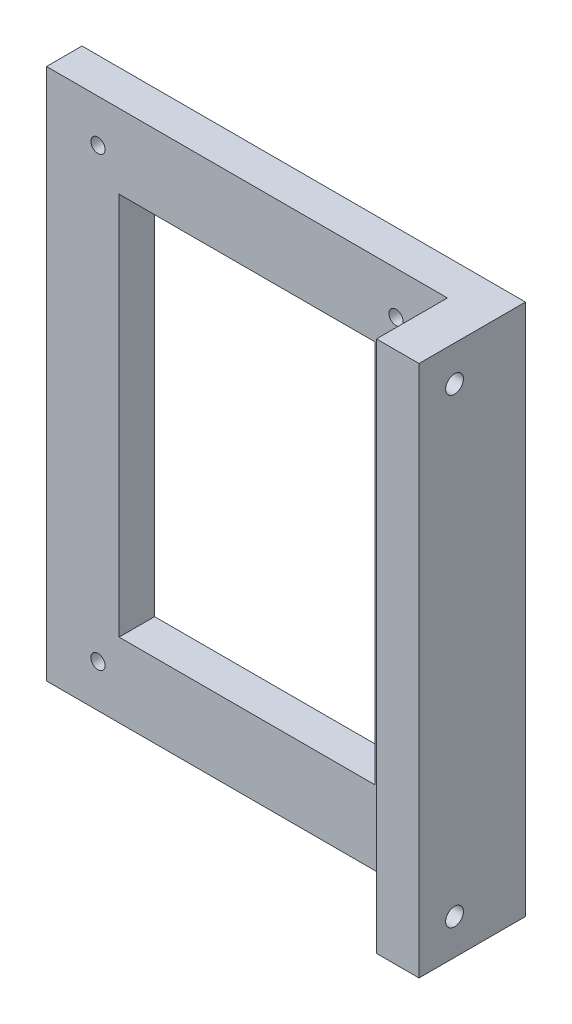
ISO-10303-21;
HEADER;
FILE_DESCRIPTION(('STEP AP214'),'2;1');
FILE_NAME('part.step','',(''),(''),'','','');
FILE_SCHEMA(('AUTOMOTIVE_DESIGN { 1 0 10303 214 1 1 1 1 }'));
ENDSEC;
DATA;
#1=APPLICATION_CONTEXT('core data for automotive mechanical design processes');
#2=APPLICATION_PROTOCOL_DEFINITION('international standard','automotive_design',2000,#1);
#3=PRODUCT_CONTEXT('',#1,'mechanical');
#4=PRODUCT('Part','Part','',(#3));
#5=PRODUCT_RELATED_PRODUCT_CATEGORY('part','',(#4));
#6=PRODUCT_DEFINITION_FORMATION('','',#4);
#7=PRODUCT_DEFINITION_CONTEXT('part definition',#1,'design');
#8=PRODUCT_DEFINITION('design','',#6,#7);
#9=PRODUCT_DEFINITION_SHAPE('','',#8);
#10=(LENGTH_UNIT() NAMED_UNIT(*) SI_UNIT(.MILLI.,.METRE.));
#11=(NAMED_UNIT(*) PLANE_ANGLE_UNIT() SI_UNIT($,.RADIAN.));
#12=(NAMED_UNIT(*) SI_UNIT($,.STERADIAN.) SOLID_ANGLE_UNIT());
#13=UNCERTAINTY_MEASURE_WITH_UNIT(LENGTH_MEASURE(1.E-05),#10,'distance_accuracy_value','');
#14=(GEOMETRIC_REPRESENTATION_CONTEXT(3) GLOBAL_UNCERTAINTY_ASSIGNED_CONTEXT((#13)) GLOBAL_UNIT_ASSIGNED_CONTEXT((#10,
#11,#12)) REPRESENTATION_CONTEXT('',''));
#15=CARTESIAN_POINT('',(0.,0.,0.));
#16=DIRECTION('',(0.,0.,1.));
#17=DIRECTION('',(1.,0.,0.));
#18=AXIS2_PLACEMENT_3D('',#15,#16,#17);
#19=CARTESIAN_POINT('',(105.384615384615,38.1923076923077,20.));
#20=DIRECTION('',(-1.,0.,0.));
#21=DIRECTION('',(0.,-1.,0.));
#22=AXIS2_PLACEMENT_3D('',#19,#20,#21);
#23=CYLINDRICAL_SURFACE('',#22,2.5);
#24=CARTESIAN_POINT('',(105.384615384615,38.1923076923077,20.));
#25=DIRECTION('',(-1.,0.,0.));
#26=DIRECTION('',(0.,-1.,0.));
#27=AXIS2_PLACEMENT_3D('',#24,#25,#26);
#28=CIRCLE('',#27,2.5);
#29=CARTESIAN_POINT('',(105.384615384615,35.6923076923077,20.));
#30=VERTEX_POINT('',#29);
#31=EDGE_CURVE('E155',#30,#30,#28,.T.);
#32=ORIENTED_EDGE('',*,*,#31,.F.);
#33=EDGE_LOOP('',(#32));
#34=FACE_BOUND('',#33,.T.);
#35=CARTESIAN_POINT('',(98.3846153846154,38.1923076923077,20.));
#36=DIRECTION('',(-1.,0.,0.));
#37=DIRECTION('',(0.,-1.,0.));
#38=AXIS2_PLACEMENT_3D('',#35,#36,#37);
#39=CIRCLE('',#38,2.5);
#40=CARTESIAN_POINT('',(98.3846153846154,35.6923076923077,20.));
#41=VERTEX_POINT('',#40);
#42=EDGE_CURVE('E221',#41,#41,#39,.F.);
#43=ORIENTED_EDGE('',*,*,#42,.F.);
#44=EDGE_LOOP('',(#43));
#45=FACE_BOUND('',#44,.T.);
#46=ADVANCED_FACE('F33',(#34,#45),#23,.F.);
#47=CARTESIAN_POINT('',(0.,0.,10.));
#48=DIRECTION('',(0.,0.,1.));
#49=DIRECTION('',(1.,0.,0.));
#50=AXIS2_PLACEMENT_3D('',#47,#48,#49);
#51=PLANE('',#50);
#52=CARTESIAN_POINT('',(78.8846153846154,-89.8076923076923,10.));
#53=DIRECTION('',(0.,0.,1.));
#54=DIRECTION('',(1.,0.,0.));
#55=AXIS2_PLACEMENT_3D('',#52,#53,#54);
#56=CIRCLE('',#55,2.);
#57=CARTESIAN_POINT('',(80.8846153846154,-89.8076923076923,10.));
#58=VERTEX_POINT('',#57);
#59=EDGE_CURVE('E192',#58,#58,#56,.T.);
#60=ORIENTED_EDGE('',*,*,#59,.F.);
#61=EDGE_LOOP('',(#60));
#62=FACE_BOUND('',#61,.T.);
#63=CARTESIAN_POINT('',(78.8846153846154,36.1923076923077,10.));
#64=DIRECTION('',(0.,0.,1.));
#65=DIRECTION('',(1.,0.,0.));
#66=AXIS2_PLACEMENT_3D('',#63,#64,#65);
#67=CIRCLE('',#66,2.);
#68=CARTESIAN_POINT('',(80.8846153846154,36.1923076923077,10.));
#69=VERTEX_POINT('',#68);
#70=EDGE_CURVE('E204',#69,#69,#67,.T.);
#71=ORIENTED_EDGE('',*,*,#70,.F.);
#72=EDGE_LOOP('',(#71));
#73=FACE_BOUND('',#72,.T.);
#74=DIRECTION('',(0.,-1.,0.));
#75=VECTOR('',#74,1.);
#76=CARTESIAN_POINT('',(-19.6153846153846,48.1923076923077,10.));
#77=LINE('',#76,#75);
#78=CARTESIAN_POINT('',(-19.6153846153846,48.1923076923077,10.));
#79=VERTEX_POINT('',#78);
#80=CARTESIAN_POINT('',(-19.6153846153846,-101.807692307692,10.));
#81=VERTEX_POINT('',#80);
#82=EDGE_CURVE('E125',#79,#81,#77,.T.);
#83=ORIENTED_EDGE('',*,*,#82,.T.);
#84=DIRECTION('',(1.,0.,0.));
#85=VECTOR('',#84,1.);
#86=CARTESIAN_POINT('',(-19.6153846153846,-101.807692307692,10.));
#87=LINE('',#86,#85);
#88=CARTESIAN_POINT('',(93.3846153846154,-101.807692307692,10.));
#89=VERTEX_POINT('',#88);
#90=EDGE_CURVE('E211',#81,#89,#87,.T.);
#91=ORIENTED_EDGE('',*,*,#90,.T.);
#92=DIRECTION('',(0.,1.,0.));
#93=VECTOR('',#92,1.);
#94=CARTESIAN_POINT('',(93.3846153846154,48.1923076923077,10.));
#95=LINE('',#94,#93);
#96=CARTESIAN_POINT('',(93.3846153846154,48.1923076923077,10.));
#97=VERTEX_POINT('',#96);
#98=EDGE_CURVE('E214',#89,#97,#95,.T.);
#99=ORIENTED_EDGE('',*,*,#98,.T.);
#100=DIRECTION('',(-1.,0.,0.));
#101=VECTOR('',#100,1.);
#102=CARTESIAN_POINT('',(-19.6153846153846,48.1923076923077,10.));
#103=LINE('',#102,#101);
#104=EDGE_CURVE('E217',#97,#79,#103,.T.);
#105=ORIENTED_EDGE('',*,*,#104,.T.);
#106=EDGE_LOOP('',(#83,#91,#99,#105));
#107=FACE_BOUND('',#106,.T.);
#108=CARTESIAN_POINT('',(-5.11538461538462,36.1923076923077,10.));
#109=DIRECTION('',(0.,0.,1.));
#110=DIRECTION('',(1.,0.,0.));
#111=AXIS2_PLACEMENT_3D('',#108,#109,#110);
#112=CIRCLE('',#111,2.);
#113=CARTESIAN_POINT('',(-3.11538461538462,36.1923076923077,10.));
#114=VERTEX_POINT('',#113);
#115=EDGE_CURVE('E198',#114,#114,#112,.T.);
#116=ORIENTED_EDGE('',*,*,#115,.F.);
#117=EDGE_LOOP('',(#116));
#118=FACE_BOUND('',#117,.T.);
#119=CARTESIAN_POINT('',(-5.11538461538462,-89.8076923076923,10.));
#120=DIRECTION('',(0.,0.,1.));
#121=DIRECTION('',(1.,0.,0.));
#122=AXIS2_PLACEMENT_3D('',#119,#120,#121);
#123=CIRCLE('',#122,2.);
#124=CARTESIAN_POINT('',(-3.11538461538462,-89.8076923076923,10.));
#125=VERTEX_POINT('',#124);
#126=EDGE_CURVE('E186',#125,#125,#123,.T.);
#127=ORIENTED_EDGE('',*,*,#126,.F.);
#128=EDGE_LOOP('',(#127));
#129=FACE_BOUND('',#128,.T.);
#130=DIRECTION('',(-1.,0.,0.));
#131=VECTOR('',#130,1.);
#132=CARTESIAN_POINT('',(0.84258804237855,27.2553487056629,10.));
#133=LINE('',#132,#131);
#134=CARTESIAN_POINT('',(72.9266427268523,27.2553487056629,10.));
#135=VERTEX_POINT('',#134);
#136=CARTESIAN_POINT('',(0.84258804237855,27.2553487056629,10.));
#137=VERTEX_POINT('',#136);
#138=EDGE_CURVE('E162',#135,#137,#133,.T.);
#139=ORIENTED_EDGE('',*,*,#138,.F.);
#140=DIRECTION('',(0.,1.,0.));
#141=VECTOR('',#140,1.);
#142=CARTESIAN_POINT('',(72.9266427268523,27.2553487056629,10.));
#143=LINE('',#142,#141);
#144=CARTESIAN_POINT('',(72.9266427268523,-80.8707333210476,10.));
#145=VERTEX_POINT('',#144);
#146=EDGE_CURVE('E160',#145,#135,#143,.T.);
#147=ORIENTED_EDGE('',*,*,#146,.F.);
#148=DIRECTION('',(1.,0.,0.));
#149=VECTOR('',#148,1.);
#150=CARTESIAN_POINT('',(0.84258804237855,-80.8707333210476,10.));
#151=LINE('',#150,#149);
#152=CARTESIAN_POINT('',(0.84258804237855,-80.8707333210476,10.));
#153=VERTEX_POINT('',#152);
#154=EDGE_CURVE('E167',#153,#145,#151,.T.);
#155=ORIENTED_EDGE('',*,*,#154,.F.);
#156=DIRECTION('',(0.,-1.,0.));
#157=VECTOR('',#156,1.);
#158=CARTESIAN_POINT('',(0.84258804237855,27.2553487056629,10.));
#159=LINE('',#158,#157);
#160=EDGE_CURVE('E165',#137,#153,#159,.T.);
#161=ORIENTED_EDGE('',*,*,#160,.F.);
#162=EDGE_LOOP('',(#139,#147,#155,#161));
#163=FACE_BOUND('',#162,.T.);
#164=ADVANCED_FACE('F262',(#62,#73,#107,#118,#129,#163),#51,.T.);
#165=CARTESIAN_POINT('',(0.,0.,0.));
#166=DIRECTION('',(0.,0.,1.));
#167=DIRECTION('',(1.,0.,0.));
#168=AXIS2_PLACEMENT_3D('',#165,#166,#167);
#169=PLANE('',#168);
#170=CARTESIAN_POINT('',(-5.11538461538462,-89.8076923076923,0.));
#171=DIRECTION('',(0.,0.,1.));
#172=DIRECTION('',(1.,0.,0.));
#173=AXIS2_PLACEMENT_3D('',#170,#171,#172);
#174=CIRCLE('',#173,2.);
#175=CARTESIAN_POINT('',(-3.11538461538462,-89.8076923076923,0.));
#176=VERTEX_POINT('',#175);
#177=EDGE_CURVE('E185',#176,#176,#174,.T.);
#178=ORIENTED_EDGE('',*,*,#177,.T.);
#179=EDGE_LOOP('',(#178));
#180=FACE_BOUND('',#179,.T.);
#181=CARTESIAN_POINT('',(78.8846153846154,-89.8076923076923,0.));
#182=DIRECTION('',(0.,0.,1.));
#183=DIRECTION('',(1.,0.,0.));
#184=AXIS2_PLACEMENT_3D('',#181,#182,#183);
#185=CIRCLE('',#184,2.);
#186=CARTESIAN_POINT('',(80.8846153846154,-89.8076923076923,0.));
#187=VERTEX_POINT('',#186);
#188=EDGE_CURVE('E189',#187,#187,#185,.T.);
#189=ORIENTED_EDGE('',*,*,#188,.T.);
#190=EDGE_LOOP('',(#189));
#191=FACE_BOUND('',#190,.T.);
#192=CARTESIAN_POINT('',(-5.11538461538462,36.1923076923077,0.));
#193=DIRECTION('',(0.,0.,1.));
#194=DIRECTION('',(1.,0.,0.));
#195=AXIS2_PLACEMENT_3D('',#192,#193,#194);
#196=CIRCLE('',#195,2.);
#197=CARTESIAN_POINT('',(-3.11538461538462,36.1923076923077,0.));
#198=VERTEX_POINT('',#197);
#199=EDGE_CURVE('E195',#198,#198,#196,.T.);
#200=ORIENTED_EDGE('',*,*,#199,.T.);
#201=EDGE_LOOP('',(#200));
#202=FACE_BOUND('',#201,.T.);
#203=CARTESIAN_POINT('',(78.8846153846154,36.1923076923077,0.));
#204=DIRECTION('',(0.,0.,1.));
#205=DIRECTION('',(1.,0.,0.));
#206=AXIS2_PLACEMENT_3D('',#203,#204,#205);
#207=CIRCLE('',#206,2.);
#208=CARTESIAN_POINT('',(80.8846153846154,36.1923076923077,0.));
#209=VERTEX_POINT('',#208);
#210=EDGE_CURVE('E201',#209,#209,#207,.T.);
#211=ORIENTED_EDGE('',*,*,#210,.T.);
#212=EDGE_LOOP('',(#211));
#213=FACE_BOUND('',#212,.T.);
#214=DIRECTION('',(0.,-1.,0.));
#215=VECTOR('',#214,1.);
#216=CARTESIAN_POINT('',(-19.6153846153846,48.1923076923077,0.));
#217=LINE('',#216,#215);
#218=CARTESIAN_POINT('',(-19.6153846153846,48.1923076923077,0.));
#219=VERTEX_POINT('',#218);
#220=CARTESIAN_POINT('',(-19.6153846153846,-101.807692307692,0.));
#221=VERTEX_POINT('',#220);
#222=EDGE_CURVE('E121',#219,#221,#217,.T.);
#223=ORIENTED_EDGE('',*,*,#222,.F.);
#224=DIRECTION('',(-1.,0.,0.));
#225=VECTOR('',#224,1.);
#226=CARTESIAN_POINT('',(-19.6153846153846,48.1923076923077,0.));
#227=LINE('',#226,#225);
#228=CARTESIAN_POINT('',(105.384615384615,48.1923076923077,0.));
#229=VERTEX_POINT('',#228);
#230=EDGE_CURVE('E114',#229,#219,#227,.T.);
#231=ORIENTED_EDGE('',*,*,#230,.F.);
#232=DIRECTION('',(0.,1.,0.));
#233=VECTOR('',#232,1.);
#234=CARTESIAN_POINT('',(105.384615384615,48.1923076923077,0.));
#235=LINE('',#234,#233);
#236=CARTESIAN_POINT('',(105.384615384615,-101.807692307692,0.));
#237=VERTEX_POINT('',#236);
#238=EDGE_CURVE('E119',#237,#229,#235,.T.);
#239=ORIENTED_EDGE('',*,*,#238,.F.);
#240=DIRECTION('',(1.,0.,0.));
#241=VECTOR('',#240,1.);
#242=CARTESIAN_POINT('',(-19.6153846153846,-101.807692307692,0.));
#243=LINE('',#242,#241);
#244=EDGE_CURVE('E126',#221,#237,#243,.T.);
#245=ORIENTED_EDGE('',*,*,#244,.F.);
#246=EDGE_LOOP('',(#223,#231,#239,#245));
#247=FACE_BOUND('',#246,.T.);
#248=DIRECTION('',(0.,1.,0.));
#249=VECTOR('',#248,1.);
#250=CARTESIAN_POINT('',(72.9266427268523,27.2553487056629,0.));
#251=LINE('',#250,#249);
#252=CARTESIAN_POINT('',(72.9266427268523,-80.8707333210476,0.));
#253=VERTEX_POINT('',#252);
#254=CARTESIAN_POINT('',(72.9266427268523,27.2553487056629,0.));
#255=VERTEX_POINT('',#254);
#256=EDGE_CURVE('E58',#253,#255,#251,.T.);
#257=ORIENTED_EDGE('',*,*,#256,.T.);
#258=DIRECTION('',(-1.,0.,0.));
#259=VECTOR('',#258,1.);
#260=CARTESIAN_POINT('',(0.84258804237855,27.2553487056629,0.));
#261=LINE('',#260,#259);
#262=CARTESIAN_POINT('',(0.84258804237855,27.2553487056629,0.));
#263=VERTEX_POINT('',#262);
#264=EDGE_CURVE('E171',#255,#263,#261,.T.);
#265=ORIENTED_EDGE('',*,*,#264,.T.);
#266=DIRECTION('',(0.,-1.,0.));
#267=VECTOR('',#266,1.);
#268=CARTESIAN_POINT('',(0.84258804237855,27.2553487056629,0.));
#269=LINE('',#268,#267);
#270=CARTESIAN_POINT('',(0.84258804237855,-80.8707333210476,0.));
#271=VERTEX_POINT('',#270);
#272=EDGE_CURVE('E174',#263,#271,#269,.T.);
#273=ORIENTED_EDGE('',*,*,#272,.T.);
#274=DIRECTION('',(1.,0.,0.));
#275=VECTOR('',#274,1.);
#276=CARTESIAN_POINT('',(0.84258804237855,-80.8707333210476,0.));
#277=LINE('',#276,#275);
#278=EDGE_CURVE('E163',#271,#253,#277,.T.);
#279=ORIENTED_EDGE('',*,*,#278,.T.);
#280=EDGE_LOOP('',(#257,#265,#273,#279));
#281=FACE_BOUND('',#280,.T.);
#282=ADVANCED_FACE('F116',(#180,#191,#202,#213,#247,#281),#169,.F.);
#283=CARTESIAN_POINT('',(-19.6153846153846,48.1923076923077,10.));
#284=DIRECTION('',(1.,0.,0.));
#285=DIRECTION('',(0.,1.,0.));
#286=AXIS2_PLACEMENT_3D('',#283,#284,#285);
#287=PLANE('',#286);
#288=ORIENTED_EDGE('',*,*,#222,.T.);
#289=DIRECTION('',(0.,0.,-1.));
#290=VECTOR('',#289,1.);
#291=CARTESIAN_POINT('',(-19.6153846153846,-101.807692307692,10.));
#292=LINE('',#291,#290);
#293=EDGE_CURVE('E11',#81,#221,#292,.T.);
#294=ORIENTED_EDGE('',*,*,#293,.F.);
#295=ORIENTED_EDGE('',*,*,#82,.F.);
#296=DIRECTION('',(0.,0.,-1.));
#297=VECTOR('',#296,1.);
#298=CARTESIAN_POINT('',(-19.6153846153846,48.1923076923077,10.));
#299=LINE('',#298,#297);
#300=EDGE_CURVE('E42',#79,#219,#299,.T.);
#301=ORIENTED_EDGE('',*,*,#300,.T.);
#302=EDGE_LOOP('',(#288,#294,#295,#301));
#303=FACE_BOUND('',#302,.T.);
#304=ADVANCED_FACE('F35',(#303),#287,.F.);
#305=CARTESIAN_POINT('',(-19.6153846153846,-101.807692307692,10.));
#306=DIRECTION('',(0.,1.,0.));
#307=DIRECTION('',(-1.,0.,0.));
#308=AXIS2_PLACEMENT_3D('',#305,#306,#307);
#309=PLANE('',#308);
#310=ORIENTED_EDGE('',*,*,#244,.T.);
#311=DIRECTION('',(0.,0.,-1.));
#312=VECTOR('',#311,1.);
#313=CARTESIAN_POINT('',(105.384615384615,-101.807692307692,0.));
#314=LINE('',#313,#312);
#315=CARTESIAN_POINT('',(105.384615384615,-101.807692307692,30.));
#316=VERTEX_POINT('',#315);
#317=EDGE_CURVE('E140',#316,#237,#314,.T.);
#318=ORIENTED_EDGE('',*,*,#317,.F.);
#319=DIRECTION('',(-1.,0.,0.));
#320=VECTOR('',#319,1.);
#321=CARTESIAN_POINT('',(105.384615384615,-101.807692307692,30.));
#322=LINE('',#321,#320);
#323=CARTESIAN_POINT('',(93.3846153846154,-101.807692307692,30.));
#324=VERTEX_POINT('',#323);
#325=EDGE_CURVE('E152',#316,#324,#322,.T.);
#326=ORIENTED_EDGE('',*,*,#325,.T.);
#327=DIRECTION('',(0.,0.,-1.));
#328=VECTOR('',#327,1.);
#329=CARTESIAN_POINT('',(93.3846153846154,-101.807692307692,0.));
#330=LINE('',#329,#328);
#331=EDGE_CURVE('E141',#324,#89,#330,.T.);
#332=ORIENTED_EDGE('',*,*,#331,.T.);
#333=ORIENTED_EDGE('',*,*,#90,.F.);
#334=ORIENTED_EDGE('',*,*,#293,.T.);
#335=EDGE_LOOP('',(#310,#318,#326,#332,#333,#334));
#336=FACE_BOUND('',#335,.T.);
#337=ADVANCED_FACE('F298',(#336),#309,.F.);
#338=CARTESIAN_POINT('',(-19.6153846153846,48.1923076923077,10.));
#339=DIRECTION('',(0.,-1.,0.));
#340=DIRECTION('',(1.,0.,0.));
#341=AXIS2_PLACEMENT_3D('',#338,#339,#340);
#342=PLANE('',#341);
#343=ORIENTED_EDGE('',*,*,#230,.T.);
#344=ORIENTED_EDGE('',*,*,#300,.F.);
#345=ORIENTED_EDGE('',*,*,#104,.F.);
#346=DIRECTION('',(0.,0.,1.));
#347=VECTOR('',#346,1.);
#348=CARTESIAN_POINT('',(93.3846153846154,48.1923076923077,0.));
#349=LINE('',#348,#347);
#350=CARTESIAN_POINT('',(93.3846153846154,48.1923076923077,30.));
#351=VERTEX_POINT('',#350);
#352=EDGE_CURVE('E153',#97,#351,#349,.T.);
#353=ORIENTED_EDGE('',*,*,#352,.T.);
#354=DIRECTION('',(-1.,0.,0.));
#355=VECTOR('',#354,1.);
#356=CARTESIAN_POINT('',(105.384615384615,48.1923076923077,30.));
#357=LINE('',#356,#355);
#358=CARTESIAN_POINT('',(105.384615384615,48.1923076923077,30.));
#359=VERTEX_POINT('',#358);
#360=EDGE_CURVE('E132',#359,#351,#357,.T.);
#361=ORIENTED_EDGE('',*,*,#360,.F.);
#362=DIRECTION('',(0.,0.,1.));
#363=VECTOR('',#362,1.);
#364=CARTESIAN_POINT('',(105.384615384615,48.1923076923077,0.));
#365=LINE('',#364,#363);
#366=EDGE_CURVE('E129',#229,#359,#365,.T.);
#367=ORIENTED_EDGE('',*,*,#366,.F.);
#368=EDGE_LOOP('',(#343,#344,#345,#353,#361,#367));
#369=FACE_BOUND('',#368,.T.);
#370=ADVANCED_FACE('F130',(#369),#342,.F.);
#371=CARTESIAN_POINT('',(78.8846153846154,36.1923076923077,10.));
#372=DIRECTION('',(0.,0.,-1.));
#373=DIRECTION('',(-1.,0.,0.));
#374=AXIS2_PLACEMENT_3D('',#371,#372,#373);
#375=CYLINDRICAL_SURFACE('',#374,2.);
#376=ORIENTED_EDGE('',*,*,#70,.T.);
#377=EDGE_LOOP('',(#376));
#378=FACE_BOUND('',#377,.T.);
#379=ORIENTED_EDGE('',*,*,#210,.F.);
#380=EDGE_LOOP('',(#379));
#381=FACE_BOUND('',#380,.T.);
#382=ADVANCED_FACE('F334',(#378,#381),#375,.F.);
#383=CARTESIAN_POINT('',(-5.11538461538462,36.1923076923077,10.));
#384=DIRECTION('',(0.,0.,-1.));
#385=DIRECTION('',(-1.,0.,0.));
#386=AXIS2_PLACEMENT_3D('',#383,#384,#385);
#387=CYLINDRICAL_SURFACE('',#386,2.);
#388=ORIENTED_EDGE('',*,*,#115,.T.);
#389=EDGE_LOOP('',(#388));
#390=FACE_BOUND('',#389,.T.);
#391=ORIENTED_EDGE('',*,*,#199,.F.);
#392=EDGE_LOOP('',(#391));
#393=FACE_BOUND('',#392,.T.);
#394=ADVANCED_FACE('F330',(#390,#393),#387,.F.);
#395=CARTESIAN_POINT('',(78.8846153846154,-89.8076923076923,10.));
#396=DIRECTION('',(0.,0.,-1.));
#397=DIRECTION('',(-1.,0.,0.));
#398=AXIS2_PLACEMENT_3D('',#395,#396,#397);
#399=CYLINDRICAL_SURFACE('',#398,2.);
#400=ORIENTED_EDGE('',*,*,#59,.T.);
#401=EDGE_LOOP('',(#400));
#402=FACE_BOUND('',#401,.T.);
#403=ORIENTED_EDGE('',*,*,#188,.F.);
#404=EDGE_LOOP('',(#403));
#405=FACE_BOUND('',#404,.T.);
#406=ADVANCED_FACE('F326',(#402,#405),#399,.F.);
#407=CARTESIAN_POINT('',(-5.11538461538462,-89.8076923076923,10.));
#408=DIRECTION('',(0.,0.,-1.));
#409=DIRECTION('',(-1.,0.,0.));
#410=AXIS2_PLACEMENT_3D('',#407,#408,#409);
#411=CYLINDRICAL_SURFACE('',#410,2.);
#412=ORIENTED_EDGE('',*,*,#126,.T.);
#413=EDGE_LOOP('',(#412));
#414=FACE_BOUND('',#413,.T.);
#415=ORIENTED_EDGE('',*,*,#177,.F.);
#416=EDGE_LOOP('',(#415));
#417=FACE_BOUND('',#416,.T.);
#418=ADVANCED_FACE('F323',(#414,#417),#411,.F.);
#419=CARTESIAN_POINT('',(72.9266427268523,27.2553487056629,10.));
#420=DIRECTION('',(-1.,0.,0.));
#421=DIRECTION('',(0.,0.,1.));
#422=AXIS2_PLACEMENT_3D('',#419,#420,#421);
#423=PLANE('',#422);
#424=ORIENTED_EDGE('',*,*,#256,.F.);
#425=DIRECTION('',(0.,0.,-1.));
#426=VECTOR('',#425,1.);
#427=CARTESIAN_POINT('',(72.9266427268523,-80.8707333210476,10.));
#428=LINE('',#427,#426);
#429=EDGE_CURVE('E169',#145,#253,#428,.T.);
#430=ORIENTED_EDGE('',*,*,#429,.F.);
#431=ORIENTED_EDGE('',*,*,#146,.T.);
#432=DIRECTION('',(0.,0.,-1.));
#433=VECTOR('',#432,1.);
#434=CARTESIAN_POINT('',(72.9266427268523,27.2553487056629,10.));
#435=LINE('',#434,#433);
#436=EDGE_CURVE('E183',#135,#255,#435,.T.);
#437=ORIENTED_EDGE('',*,*,#436,.T.);
#438=EDGE_LOOP('',(#424,#430,#431,#437));
#439=FACE_BOUND('',#438,.T.);
#440=ADVANCED_FACE('F319',(#439),#423,.T.);
#441=CARTESIAN_POINT('',(0.84258804237855,27.2553487056629,10.));
#442=DIRECTION('',(0.,-1.,0.));
#443=DIRECTION('',(0.,0.,-1.));
#444=AXIS2_PLACEMENT_3D('',#441,#442,#443);
#445=PLANE('',#444);
#446=ORIENTED_EDGE('',*,*,#264,.F.);
#447=ORIENTED_EDGE('',*,*,#436,.F.);
#448=ORIENTED_EDGE('',*,*,#138,.T.);
#449=DIRECTION('',(0.,0.,-1.));
#450=VECTOR('',#449,1.);
#451=CARTESIAN_POINT('',(0.84258804237855,27.2553487056629,10.));
#452=LINE('',#451,#450);
#453=EDGE_CURVE('E181',#137,#263,#452,.T.);
#454=ORIENTED_EDGE('',*,*,#453,.T.);
#455=EDGE_LOOP('',(#446,#447,#448,#454));
#456=FACE_BOUND('',#455,.T.);
#457=ADVANCED_FACE('F315',(#456),#445,.T.);
#458=CARTESIAN_POINT('',(0.84258804237855,27.2553487056629,10.));
#459=DIRECTION('',(1.,0.,0.));
#460=DIRECTION('',(0.,0.,-1.));
#461=AXIS2_PLACEMENT_3D('',#458,#459,#460);
#462=PLANE('',#461);
#463=ORIENTED_EDGE('',*,*,#272,.F.);
#464=ORIENTED_EDGE('',*,*,#453,.F.);
#465=ORIENTED_EDGE('',*,*,#160,.T.);
#466=DIRECTION('',(0.,0.,-1.));
#467=VECTOR('',#466,1.);
#468=CARTESIAN_POINT('',(0.84258804237855,-80.8707333210476,10.));
#469=LINE('',#468,#467);
#470=EDGE_CURVE('E50',#153,#271,#469,.T.);
#471=ORIENTED_EDGE('',*,*,#470,.T.);
#472=EDGE_LOOP('',(#463,#464,#465,#471));
#473=FACE_BOUND('',#472,.T.);
#474=ADVANCED_FACE('F312',(#473),#462,.T.);
#475=CARTESIAN_POINT('',(0.84258804237855,-80.8707333210476,10.));
#476=DIRECTION('',(0.,1.,0.));
#477=DIRECTION('',(0.,0.,1.));
#478=AXIS2_PLACEMENT_3D('',#475,#476,#477);
#479=PLANE('',#478);
#480=ORIENTED_EDGE('',*,*,#278,.F.);
#481=ORIENTED_EDGE('',*,*,#470,.F.);
#482=ORIENTED_EDGE('',*,*,#154,.T.);
#483=ORIENTED_EDGE('',*,*,#429,.T.);
#484=EDGE_LOOP('',(#480,#481,#482,#483));
#485=FACE_BOUND('',#484,.T.);
#486=ADVANCED_FACE('F289',(#485),#479,.T.);
#487=CARTESIAN_POINT('',(93.3846153846154,0.,0.));
#488=DIRECTION('',(-1.,0.,0.));
#489=DIRECTION('',(0.,-1.,0.));
#490=AXIS2_PLACEMENT_3D('',#487,#488,#489);
#491=PLANE('',#490);
#492=CARTESIAN_POINT('',(93.3846153846154,38.1923076923077,20.));
#493=DIRECTION('',(-1.,0.,0.));
#494=DIRECTION('',(0.,-1.,0.));
#495=AXIS2_PLACEMENT_3D('',#492,#493,#494);
#496=CIRCLE('',#495,4.5);
#497=CARTESIAN_POINT('',(93.3846153846154,33.6923076923077,20.));
#498=VERTEX_POINT('',#497);
#499=EDGE_CURVE('E228',#498,#498,#496,.T.);
#500=ORIENTED_EDGE('',*,*,#499,.F.);
#501=EDGE_LOOP('',(#500));
#502=FACE_BOUND('',#501,.T.);
#503=CARTESIAN_POINT('',(93.3846153846154,-91.8076923076923,19.9999999999999));
#504=DIRECTION('',(-1.,0.,0.));
#505=DIRECTION('',(0.,1.,0.));
#506=AXIS2_PLACEMENT_3D('',#503,#504,#505);
#507=CIRCLE('',#506,4.5);
#508=CARTESIAN_POINT('',(93.3846153846154,-87.3076923076923,19.9999999999999));
#509=VERTEX_POINT('',#508);
#510=EDGE_CURVE('E238',#509,#509,#507,.T.);
#511=ORIENTED_EDGE('',*,*,#510,.F.);
#512=EDGE_LOOP('',(#511));
#513=FACE_BOUND('',#512,.T.);
#514=ORIENTED_EDGE('',*,*,#98,.F.);
#515=ORIENTED_EDGE('',*,*,#331,.F.);
#516=DIRECTION('',(0.,-1.,0.));
#517=VECTOR('',#516,1.);
#518=CARTESIAN_POINT('',(93.3846153846154,48.1923076923077,30.));
#519=LINE('',#518,#517);
#520=EDGE_CURVE('E144',#351,#324,#519,.T.);
#521=ORIENTED_EDGE('',*,*,#520,.F.);
#522=ORIENTED_EDGE('',*,*,#352,.F.);
#523=EDGE_LOOP('',(#514,#515,#521,#522));
#524=FACE_BOUND('',#523,.T.);
#525=ADVANCED_FACE('F286',(#502,#513,#524),#491,.T.);
#526=CARTESIAN_POINT('',(105.384615384615,48.1923076923077,30.));
#527=DIRECTION('',(0.,0.,-1.));
#528=DIRECTION('',(0.,1.,0.));
#529=AXIS2_PLACEMENT_3D('',#526,#527,#528);
#530=PLANE('',#529);
#531=ORIENTED_EDGE('',*,*,#520,.T.);
#532=ORIENTED_EDGE('',*,*,#325,.F.);
#533=DIRECTION('',(0.,-1.,0.));
#534=VECTOR('',#533,1.);
#535=CARTESIAN_POINT('',(105.384615384615,48.1923076923077,30.));
#536=LINE('',#535,#534);
#537=EDGE_CURVE('E135',#359,#316,#536,.T.);
#538=ORIENTED_EDGE('',*,*,#537,.F.);
#539=ORIENTED_EDGE('',*,*,#360,.T.);
#540=EDGE_LOOP('',(#531,#532,#538,#539));
#541=FACE_BOUND('',#540,.T.);
#542=ADVANCED_FACE('F258',(#541),#530,.F.);
#543=CARTESIAN_POINT('',(105.384615384615,0.,0.));
#544=DIRECTION('',(-1.,0.,0.));
#545=DIRECTION('',(0.,-1.,0.));
#546=AXIS2_PLACEMENT_3D('',#543,#544,#545);
#547=PLANE('',#546);
#548=ORIENTED_EDGE('',*,*,#31,.T.);
#549=EDGE_LOOP('',(#548));
#550=FACE_BOUND('',#549,.T.);
#551=CARTESIAN_POINT('',(105.384615384615,-91.8076923076923,19.9999999999999));
#552=DIRECTION('',(-1.,0.,0.));
#553=DIRECTION('',(0.,1.,0.));
#554=AXIS2_PLACEMENT_3D('',#551,#552,#553);
#555=CIRCLE('',#554,2.5);
#556=CARTESIAN_POINT('',(105.384615384615,-89.3076923076923,19.9999999999999));
#557=VERTEX_POINT('',#556);
#558=EDGE_CURVE('E147',#557,#557,#555,.T.);
#559=ORIENTED_EDGE('',*,*,#558,.T.);
#560=EDGE_LOOP('',(#559));
#561=FACE_BOUND('',#560,.T.);
#562=ORIENTED_EDGE('',*,*,#238,.T.);
#563=ORIENTED_EDGE('',*,*,#366,.T.);
#564=ORIENTED_EDGE('',*,*,#537,.T.);
#565=ORIENTED_EDGE('',*,*,#317,.T.);
#566=EDGE_LOOP('',(#562,#563,#564,#565));
#567=FACE_BOUND('',#566,.T.);
#568=ADVANCED_FACE('F138',(#550,#561,#567),#547,.F.);
#569=CARTESIAN_POINT('',(105.384615384615,-91.8076923076923,19.9999999999999));
#570=DIRECTION('',(-1.,0.,0.));
#571=DIRECTION('',(0.,-1.,0.));
#572=AXIS2_PLACEMENT_3D('',#569,#570,#571);
#573=CYLINDRICAL_SURFACE('',#572,2.5);
#574=CARTESIAN_POINT('',(98.3846153846154,-91.8076923076923,19.9999999999999));
#575=DIRECTION('',(1.,0.,0.));
#576=DIRECTION('',(0.,1.,0.));
#577=AXIS2_PLACEMENT_3D('',#574,#575,#576);
#578=CIRCLE('',#577,2.5);
#579=CARTESIAN_POINT('',(98.3846153846154,-89.3076923076923,19.9999999999999));
#580=VERTEX_POINT('',#579);
#581=EDGE_CURVE('E37',#580,#580,#578,.F.);
#582=ORIENTED_EDGE('',*,*,#581,.T.);
#583=EDGE_LOOP('',(#582));
#584=FACE_BOUND('',#583,.T.);
#585=ORIENTED_EDGE('',*,*,#558,.F.);
#586=EDGE_LOOP('',(#585));
#587=FACE_BOUND('',#586,.T.);
#588=ADVANCED_FACE('F247',(#584,#587),#573,.F.);
#589=CARTESIAN_POINT('',(98.3846153846154,38.1923076923077,20.));
#590=DIRECTION('',(-1.,0.,0.));
#591=DIRECTION('',(0.,-1.,0.));
#592=AXIS2_PLACEMENT_3D('',#589,#590,#591);
#593=PLANE('',#592);
#594=CARTESIAN_POINT('',(98.3846153846154,38.1923076923077,20.));
#595=DIRECTION('',(-1.,0.,0.));
#596=DIRECTION('',(0.,-1.,0.));
#597=AXIS2_PLACEMENT_3D('',#594,#595,#596);
#598=CIRCLE('',#597,4.5);
#599=CARTESIAN_POINT('',(98.3846153846154,33.6923076923077,20.));
#600=VERTEX_POINT('',#599);
#601=EDGE_CURVE('E223',#600,#600,#598,.T.);
#602=ORIENTED_EDGE('',*,*,#601,.T.);
#603=EDGE_LOOP('',(#602));
#604=FACE_BOUND('',#603,.T.);
#605=ORIENTED_EDGE('',*,*,#42,.T.);
#606=EDGE_LOOP('',(#605));
#607=FACE_BOUND('',#606,.T.);
#608=ADVANCED_FACE('F249',(#604,#607),#593,.T.);
#609=CARTESIAN_POINT('',(98.3846153846154,38.1923076923077,20.));
#610=DIRECTION('',(-1.,0.,0.));
#611=DIRECTION('',(0.,-1.,0.));
#612=AXIS2_PLACEMENT_3D('',#609,#610,#611);
#613=CYLINDRICAL_SURFACE('',#612,4.5);
#614=ORIENTED_EDGE('',*,*,#601,.F.);
#615=EDGE_LOOP('',(#614));
#616=FACE_BOUND('',#615,.T.);
#617=ORIENTED_EDGE('',*,*,#499,.T.);
#618=EDGE_LOOP('',(#617));
#619=FACE_BOUND('',#618,.T.);
#620=ADVANCED_FACE('F256',(#616,#619),#613,.F.);
#621=CARTESIAN_POINT('',(98.3846153846154,-91.8076923076923,19.9999999999999));
#622=DIRECTION('',(1.,0.,0.));
#623=DIRECTION('',(0.,1.,0.));
#624=AXIS2_PLACEMENT_3D('',#621,#622,#623);
#625=PLANE('',#624);
#626=CARTESIAN_POINT('',(98.3846153846154,-91.8076923076923,19.9999999999999));
#627=DIRECTION('',(-1.,0.,0.));
#628=DIRECTION('',(0.,1.,0.));
#629=AXIS2_PLACEMENT_3D('',#626,#627,#628);
#630=CIRCLE('',#629,4.5);
#631=CARTESIAN_POINT('',(98.3846153846154,-87.3076923076923,19.9999999999999));
#632=VERTEX_POINT('',#631);
#633=EDGE_CURVE('E233',#632,#632,#630,.T.);
#634=ORIENTED_EDGE('',*,*,#633,.T.);
#635=EDGE_LOOP('',(#634));
#636=FACE_BOUND('',#635,.T.);
#637=ORIENTED_EDGE('',*,*,#581,.F.);
#638=EDGE_LOOP('',(#637));
#639=FACE_BOUND('',#638,.T.);
#640=ADVANCED_FACE('F274',(#636,#639),#625,.F.);
#641=CARTESIAN_POINT('',(98.3846153846154,-91.8076923076923,19.9999999999999));
#642=DIRECTION('',(-1.,0.,0.));
#643=DIRECTION('',(0.,-1.,0.));
#644=AXIS2_PLACEMENT_3D('',#641,#642,#643);
#645=CYLINDRICAL_SURFACE('',#644,4.5);
#646=ORIENTED_EDGE('',*,*,#633,.F.);
#647=EDGE_LOOP('',(#646));
#648=FACE_BOUND('',#647,.T.);
#649=ORIENTED_EDGE('',*,*,#510,.T.);
#650=EDGE_LOOP('',(#649));
#651=FACE_BOUND('',#650,.T.);
#652=ADVANCED_FACE('F271',(#648,#651),#645,.F.);
#653=CLOSED_SHELL('',(#46,#164,#282,#304,#337,#370,#382,#394,#406,#418,#440,#457,#474,#486,#525,
#542,#568,#588,#608,#620,#640,#652));
#654=MANIFOLD_SOLID_BREP('B2',#653);
#655=ADVANCED_BREP_SHAPE_REPRESENTATION('',(#18,#654),#14);
#656=SHAPE_DEFINITION_REPRESENTATION(#9,#655);
ENDSEC;
END-ISO-10303-21;
